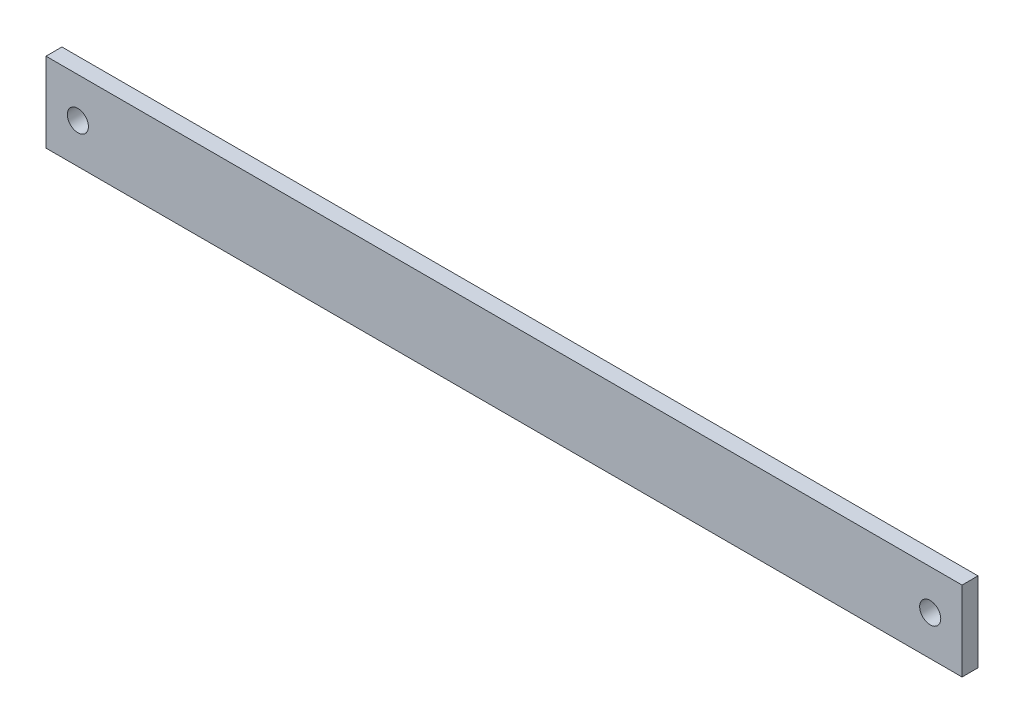
ISO-10303-21;
HEADER;
FILE_DESCRIPTION(('STEP AP214'),'2;1');
FILE_NAME('part.step','',(''),(''),'','','');
FILE_SCHEMA(('AUTOMOTIVE_DESIGN { 1 0 10303 214 1 1 1 1 }'));
ENDSEC;
DATA;
#1=APPLICATION_CONTEXT('core data for automotive mechanical design processes');
#2=APPLICATION_PROTOCOL_DEFINITION('international standard','automotive_design',2000,#1);
#3=PRODUCT_CONTEXT('',#1,'mechanical');
#4=PRODUCT('Part','Part','',(#3));
#5=PRODUCT_RELATED_PRODUCT_CATEGORY('part','',(#4));
#6=PRODUCT_DEFINITION_FORMATION('','',#4);
#7=PRODUCT_DEFINITION_CONTEXT('part definition',#1,'design');
#8=PRODUCT_DEFINITION('design','',#6,#7);
#9=PRODUCT_DEFINITION_SHAPE('','',#8);
#10=(LENGTH_UNIT() NAMED_UNIT(*) SI_UNIT(.MILLI.,.METRE.));
#11=(NAMED_UNIT(*) PLANE_ANGLE_UNIT() SI_UNIT($,.RADIAN.));
#12=(NAMED_UNIT(*) SI_UNIT($,.STERADIAN.) SOLID_ANGLE_UNIT());
#13=UNCERTAINTY_MEASURE_WITH_UNIT(LENGTH_MEASURE(1.E-05),#10,'distance_accuracy_value','');
#14=(GEOMETRIC_REPRESENTATION_CONTEXT(3) GLOBAL_UNCERTAINTY_ASSIGNED_CONTEXT((#13)) GLOBAL_UNIT_ASSIGNED_CONTEXT((#10,
#11,#12)) REPRESENTATION_CONTEXT('',''));
#15=CARTESIAN_POINT('',(0.,0.,0.));
#16=DIRECTION('',(0.,0.,1.));
#17=DIRECTION('',(1.,0.,0.));
#18=AXIS2_PLACEMENT_3D('',#15,#16,#17);
#19=CARTESIAN_POINT('',(0.,20.,-4.));
#20=DIRECTION('',(0.,1.,0.));
#21=DIRECTION('',(0.,0.,1.));
#22=AXIS2_PLACEMENT_3D('',#19,#20,#21);
#23=PLANE('',#22);
#24=DIRECTION('',(-1.,0.,0.));
#25=VECTOR('',#24,1.);
#26=CARTESIAN_POINT('',(0.,20.,0.));
#27=LINE('',#26,#25);
#28=CARTESIAN_POINT('',(230.,20.,0.));
#29=VERTEX_POINT('',#28);
#30=CARTESIAN_POINT('',(0.,20.,0.));
#31=VERTEX_POINT('',#30);
#32=EDGE_CURVE('E108',#29,#31,#27,.T.);
#33=ORIENTED_EDGE('',*,*,#32,.F.);
#34=DIRECTION('',(0.,0.,1.));
#35=VECTOR('',#34,1.);
#36=CARTESIAN_POINT('',(230.,20.,-4.));
#37=LINE('',#36,#35);
#38=CARTESIAN_POINT('',(230.,20.,-4.));
#39=VERTEX_POINT('',#38);
#40=EDGE_CURVE('E11',#39,#29,#37,.T.);
#41=ORIENTED_EDGE('',*,*,#40,.F.);
#42=DIRECTION('',(-1.,0.,0.));
#43=VECTOR('',#42,1.);
#44=CARTESIAN_POINT('',(0.,20.,-4.));
#45=LINE('',#44,#43);
#46=CARTESIAN_POINT('',(0.,20.,-4.));
#47=VERTEX_POINT('',#46);
#48=EDGE_CURVE('E100',#39,#47,#45,.T.);
#49=ORIENTED_EDGE('',*,*,#48,.T.);
#50=DIRECTION('',(0.,0.,1.));
#51=VECTOR('',#50,1.);
#52=CARTESIAN_POINT('',(0.,20.,-4.));
#53=LINE('',#52,#51);
#54=EDGE_CURVE('E44',#47,#31,#53,.T.);
#55=ORIENTED_EDGE('',*,*,#54,.T.);
#56=EDGE_LOOP('',(#33,#41,#49,#55));
#57=FACE_BOUND('',#56,.T.);
#58=ADVANCED_FACE('F41',(#57),#23,.T.);
#59=CARTESIAN_POINT('',(230.,20.,-4.));
#60=DIRECTION('',(1.,0.,0.));
#61=DIRECTION('',(0.,0.,-1.));
#62=AXIS2_PLACEMENT_3D('',#59,#60,#61);
#63=PLANE('',#62);
#64=DIRECTION('',(0.,1.,0.));
#65=VECTOR('',#64,1.);
#66=CARTESIAN_POINT('',(230.,20.,0.));
#67=LINE('',#66,#65);
#68=CARTESIAN_POINT('',(230.,0.,0.));
#69=VERTEX_POINT('',#68);
#70=EDGE_CURVE('E103',#69,#29,#67,.T.);
#71=ORIENTED_EDGE('',*,*,#70,.F.);
#72=DIRECTION('',(0.,0.,1.));
#73=VECTOR('',#72,1.);
#74=CARTESIAN_POINT('',(230.,0.,-4.));
#75=LINE('',#74,#73);
#76=CARTESIAN_POINT('',(230.,0.,-4.));
#77=VERTEX_POINT('',#76);
#78=EDGE_CURVE('E50',#77,#69,#75,.T.);
#79=ORIENTED_EDGE('',*,*,#78,.F.);
#80=DIRECTION('',(0.,1.,0.));
#81=VECTOR('',#80,1.);
#82=CARTESIAN_POINT('',(230.,20.,-4.));
#83=LINE('',#82,#81);
#84=EDGE_CURVE('E96',#77,#39,#83,.T.);
#85=ORIENTED_EDGE('',*,*,#84,.T.);
#86=ORIENTED_EDGE('',*,*,#40,.T.);
#87=EDGE_LOOP('',(#71,#79,#85,#86));
#88=FACE_BOUND('',#87,.T.);
#89=ADVANCED_FACE('F121',(#88),#63,.T.);
#90=CARTESIAN_POINT('',(0.,0.,-4.));
#91=DIRECTION('',(0.,-1.,0.));
#92=DIRECTION('',(0.,0.,-1.));
#93=AXIS2_PLACEMENT_3D('',#90,#91,#92);
#94=PLANE('',#93);
#95=DIRECTION('',(1.,0.,0.));
#96=VECTOR('',#95,1.);
#97=CARTESIAN_POINT('',(0.,0.,0.));
#98=LINE('',#97,#96);
#99=CARTESIAN_POINT('',(0.,0.,0.));
#100=VERTEX_POINT('',#99);
#101=EDGE_CURVE('E91',#100,#69,#98,.T.);
#102=ORIENTED_EDGE('',*,*,#101,.F.);
#103=DIRECTION('',(0.,0.,1.));
#104=VECTOR('',#103,1.);
#105=CARTESIAN_POINT('',(0.,0.,-4.));
#106=LINE('',#105,#104);
#107=CARTESIAN_POINT('',(0.,0.,-4.));
#108=VERTEX_POINT('',#107);
#109=EDGE_CURVE('E86',#108,#100,#106,.T.);
#110=ORIENTED_EDGE('',*,*,#109,.F.);
#111=DIRECTION('',(1.,0.,0.));
#112=VECTOR('',#111,1.);
#113=CARTESIAN_POINT('',(0.,0.,-4.));
#114=LINE('',#113,#112);
#115=EDGE_CURVE('E89',#108,#77,#114,.T.);
#116=ORIENTED_EDGE('',*,*,#115,.T.);
#117=ORIENTED_EDGE('',*,*,#78,.T.);
#118=EDGE_LOOP('',(#102,#110,#116,#117));
#119=FACE_BOUND('',#118,.T.);
#120=ADVANCED_FACE('F88',(#119),#94,.T.);
#121=CARTESIAN_POINT('',(0.,20.,-4.));
#122=DIRECTION('',(-1.,0.,0.));
#123=DIRECTION('',(0.,0.,1.));
#124=AXIS2_PLACEMENT_3D('',#121,#122,#123);
#125=PLANE('',#124);
#126=DIRECTION('',(0.,-1.,0.));
#127=VECTOR('',#126,1.);
#128=CARTESIAN_POINT('',(0.,20.,0.));
#129=LINE('',#128,#127);
#130=EDGE_CURVE('E112',#31,#100,#129,.T.);
#131=ORIENTED_EDGE('',*,*,#130,.F.);
#132=ORIENTED_EDGE('',*,*,#54,.F.);
#133=DIRECTION('',(0.,-1.,0.));
#134=VECTOR('',#133,1.);
#135=CARTESIAN_POINT('',(0.,20.,-4.));
#136=LINE('',#135,#134);
#137=EDGE_CURVE('E95',#47,#108,#136,.T.);
#138=ORIENTED_EDGE('',*,*,#137,.T.);
#139=ORIENTED_EDGE('',*,*,#109,.T.);
#140=EDGE_LOOP('',(#131,#132,#138,#139));
#141=FACE_BOUND('',#140,.T.);
#142=ADVANCED_FACE('F99',(#141),#125,.T.);
#143=CARTESIAN_POINT('',(0.,0.,-4.));
#144=DIRECTION('',(0.,0.,-1.));
#145=DIRECTION('',(-1.,0.,0.));
#146=AXIS2_PLACEMENT_3D('',#143,#144,#145);
#147=PLANE('',#146);
#148=CARTESIAN_POINT('',(222.,10.,-4.));
#149=DIRECTION('',(0.,0.,1.));
#150=DIRECTION('',(1.,0.,0.));
#151=AXIS2_PLACEMENT_3D('',#148,#149,#150);
#152=CIRCLE('',#151,2.65000000000001);
#153=CARTESIAN_POINT('',(224.65,10.,-4.));
#154=VERTEX_POINT('',#153);
#155=EDGE_CURVE('E154',#154,#154,#152,.T.);
#156=ORIENTED_EDGE('',*,*,#155,.T.);
#157=EDGE_LOOP('',(#156));
#158=FACE_BOUND('',#157,.T.);
#159=CARTESIAN_POINT('',(8.,10.,-4.));
#160=DIRECTION('',(0.,0.,1.));
#161=DIRECTION('',(1.,0.,0.));
#162=AXIS2_PLACEMENT_3D('',#159,#160,#161);
#163=CIRCLE('',#162,2.65);
#164=CARTESIAN_POINT('',(10.65,10.,-4.));
#165=VERTEX_POINT('',#164);
#166=EDGE_CURVE('E113',#165,#165,#163,.T.);
#167=ORIENTED_EDGE('',*,*,#166,.T.);
#168=EDGE_LOOP('',(#167));
#169=FACE_BOUND('',#168,.T.);
#170=ORIENTED_EDGE('',*,*,#48,.F.);
#171=ORIENTED_EDGE('',*,*,#84,.F.);
#172=ORIENTED_EDGE('',*,*,#115,.F.);
#173=ORIENTED_EDGE('',*,*,#137,.F.);
#174=EDGE_LOOP('',(#170,#171,#172,#173));
#175=FACE_BOUND('',#174,.T.);
#176=ADVANCED_FACE('F94',(#158,#169,#175),#147,.T.);
#177=CARTESIAN_POINT('',(0.,0.,0.));
#178=DIRECTION('',(0.,0.,-1.));
#179=DIRECTION('',(-1.,0.,0.));
#180=AXIS2_PLACEMENT_3D('',#177,#178,#179);
#181=PLANE('',#180);
#182=CARTESIAN_POINT('',(222.,10.,0.));
#183=DIRECTION('',(0.,0.,1.));
#184=DIRECTION('',(1.,0.,0.));
#185=AXIS2_PLACEMENT_3D('',#182,#183,#184);
#186=CIRCLE('',#185,2.65000000000001);
#187=CARTESIAN_POINT('',(224.65,10.,0.));
#188=VERTEX_POINT('',#187);
#189=EDGE_CURVE('E157',#188,#188,#186,.T.);
#190=ORIENTED_EDGE('',*,*,#189,.F.);
#191=EDGE_LOOP('',(#190));
#192=FACE_BOUND('',#191,.T.);
#193=CARTESIAN_POINT('',(8.,10.,0.));
#194=DIRECTION('',(0.,0.,1.));
#195=DIRECTION('',(1.,0.,0.));
#196=AXIS2_PLACEMENT_3D('',#193,#194,#195);
#197=CIRCLE('',#196,2.65);
#198=CARTESIAN_POINT('',(10.65,10.,0.));
#199=VERTEX_POINT('',#198);
#200=EDGE_CURVE('E159',#199,#199,#197,.T.);
#201=ORIENTED_EDGE('',*,*,#200,.F.);
#202=EDGE_LOOP('',(#201));
#203=FACE_BOUND('',#202,.T.);
#204=ORIENTED_EDGE('',*,*,#32,.T.);
#205=ORIENTED_EDGE('',*,*,#130,.T.);
#206=ORIENTED_EDGE('',*,*,#101,.T.);
#207=ORIENTED_EDGE('',*,*,#70,.T.);
#208=EDGE_LOOP('',(#204,#205,#206,#207));
#209=FACE_BOUND('',#208,.T.);
#210=ADVANCED_FACE('F120',(#192,#203,#209),#181,.F.);
#211=CARTESIAN_POINT('',(8.,10.,-4.));
#212=DIRECTION('',(0.,0.,1.));
#213=DIRECTION('',(1.,0.,0.));
#214=AXIS2_PLACEMENT_3D('',#211,#212,#213);
#215=CYLINDRICAL_SURFACE('',#214,2.65);
#216=ORIENTED_EDGE('',*,*,#166,.F.);
#217=EDGE_LOOP('',(#216));
#218=FACE_BOUND('',#217,.T.);
#219=ORIENTED_EDGE('',*,*,#200,.T.);
#220=EDGE_LOOP('',(#219));
#221=FACE_BOUND('',#220,.T.);
#222=ADVANCED_FACE('F139',(#218,#221),#215,.F.);
#223=CARTESIAN_POINT('',(222.,10.,-4.));
#224=DIRECTION('',(0.,0.,1.));
#225=DIRECTION('',(1.,0.,0.));
#226=AXIS2_PLACEMENT_3D('',#223,#224,#225);
#227=CYLINDRICAL_SURFACE('',#226,2.65000000000001);
#228=ORIENTED_EDGE('',*,*,#155,.F.);
#229=EDGE_LOOP('',(#228));
#230=FACE_BOUND('',#229,.T.);
#231=ORIENTED_EDGE('',*,*,#189,.T.);
#232=EDGE_LOOP('',(#231));
#233=FACE_BOUND('',#232,.T.);
#234=ADVANCED_FACE('F146',(#230,#233),#227,.F.);
#235=CLOSED_SHELL('',(#58,#89,#120,#142,#176,#210,#222,#234));
#236=MANIFOLD_SOLID_BREP('B2',#235);
#237=ADVANCED_BREP_SHAPE_REPRESENTATION('',(#18,#236),#14);
#238=SHAPE_DEFINITION_REPRESENTATION(#9,#237);
ENDSEC;
END-ISO-10303-21;
